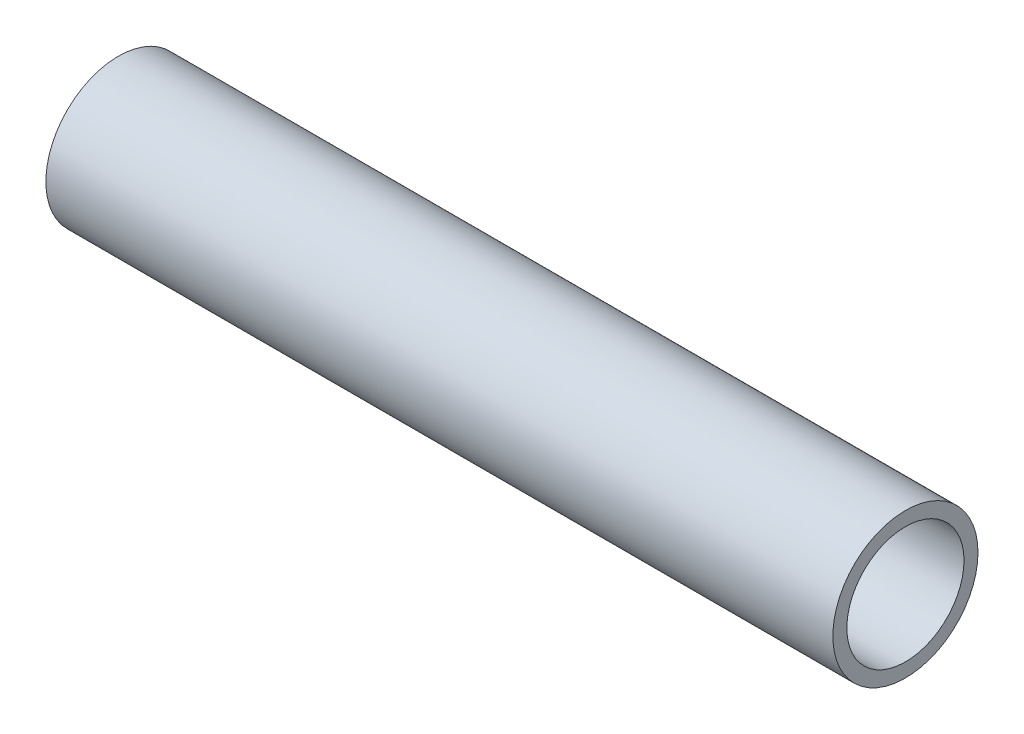
ISO-10303-21;
HEADER;
FILE_DESCRIPTION(('STEP AP214'),'2;1');
FILE_NAME('part.step','',(''),(''),'','','');
FILE_SCHEMA(('AUTOMOTIVE_DESIGN { 1 0 10303 214 1 1 1 1 }'));
ENDSEC;
DATA;
#1=APPLICATION_CONTEXT('core data for automotive mechanical design processes');
#2=APPLICATION_PROTOCOL_DEFINITION('international standard','automotive_design',2000,#1);
#3=PRODUCT_CONTEXT('',#1,'mechanical');
#4=PRODUCT('Part','Part','',(#3));
#5=PRODUCT_RELATED_PRODUCT_CATEGORY('part','',(#4));
#6=PRODUCT_DEFINITION_FORMATION('','',#4);
#7=PRODUCT_DEFINITION_CONTEXT('part definition',#1,'design');
#8=PRODUCT_DEFINITION('design','',#6,#7);
#9=PRODUCT_DEFINITION_SHAPE('','',#8);
#10=(LENGTH_UNIT() NAMED_UNIT(*) SI_UNIT(.MILLI.,.METRE.));
#11=(NAMED_UNIT(*) PLANE_ANGLE_UNIT() SI_UNIT($,.RADIAN.));
#12=(NAMED_UNIT(*) SI_UNIT($,.STERADIAN.) SOLID_ANGLE_UNIT());
#13=UNCERTAINTY_MEASURE_WITH_UNIT(LENGTH_MEASURE(1.E-05),#10,'distance_accuracy_value','');
#14=(GEOMETRIC_REPRESENTATION_CONTEXT(3) GLOBAL_UNCERTAINTY_ASSIGNED_CONTEXT((#13)) GLOBAL_UNIT_ASSIGNED_CONTEXT((#10,
#11,#12)) REPRESENTATION_CONTEXT('',''));
#15=CARTESIAN_POINT('',(0.,0.,0.));
#16=DIRECTION('',(0.,0.,1.));
#17=DIRECTION('',(1.,0.,0.));
#18=AXIS2_PLACEMENT_3D('',#15,#16,#17);
#19=CARTESIAN_POINT('',(228.6,0.,0.));
#20=DIRECTION('',(1.,0.,0.));
#21=DIRECTION('',(0.,0.,-1.));
#22=AXIS2_PLACEMENT_3D('',#19,#20,#21);
#23=PLANE('',#22);
#24=CARTESIAN_POINT('',(228.6,0.,0.));
#25=DIRECTION('',(1.,0.,0.));
#26=DIRECTION('',(0.,0.,-1.));
#27=AXIS2_PLACEMENT_3D('',#24,#25,#26);
#28=CIRCLE('',#27,21.082);
#29=CARTESIAN_POINT('',(228.6,0.,-21.082));
#30=VERTEX_POINT('',#29);
#31=EDGE_CURVE('E10',#30,#30,#28,.T.);
#32=ORIENTED_EDGE('',*,*,#31,.T.);
#33=EDGE_LOOP('',(#32));
#34=FACE_BOUND('',#33,.T.);
#35=CARTESIAN_POINT('',(228.6,0.,0.));
#36=DIRECTION('',(1.,0.,0.));
#37=DIRECTION('',(0.,0.,-1.));
#38=AXIS2_PLACEMENT_3D('',#35,#36,#37);
#39=CIRCLE('',#38,17.018);
#40=CARTESIAN_POINT('',(228.6,0.,-17.018));
#41=VERTEX_POINT('',#40);
#42=EDGE_CURVE('E45',#41,#41,#39,.T.);
#43=ORIENTED_EDGE('',*,*,#42,.F.);
#44=EDGE_LOOP('',(#43));
#45=FACE_BOUND('',#44,.T.);
#46=ADVANCED_FACE('F32',(#34,#45),#23,.T.);
#47=CARTESIAN_POINT('',(0.,0.,0.));
#48=DIRECTION('',(1.,0.,0.));
#49=DIRECTION('',(0.,0.,-1.));
#50=AXIS2_PLACEMENT_3D('',#47,#48,#49);
#51=PLANE('',#50);
#52=CARTESIAN_POINT('',(0.,0.,0.));
#53=DIRECTION('',(1.,0.,0.));
#54=DIRECTION('',(0.,0.,-1.));
#55=AXIS2_PLACEMENT_3D('',#52,#53,#54);
#56=CIRCLE('',#55,21.082);
#57=CARTESIAN_POINT('',(0.,0.,-21.082));
#58=VERTEX_POINT('',#57);
#59=EDGE_CURVE('E36',#58,#58,#56,.T.);
#60=ORIENTED_EDGE('',*,*,#59,.F.);
#61=EDGE_LOOP('',(#60));
#62=FACE_BOUND('',#61,.T.);
#63=CARTESIAN_POINT('',(0.,0.,0.));
#64=DIRECTION('',(1.,0.,0.));
#65=DIRECTION('',(0.,0.,-1.));
#66=AXIS2_PLACEMENT_3D('',#63,#64,#65);
#67=CIRCLE('',#66,17.018);
#68=CARTESIAN_POINT('',(0.,0.,-17.018));
#69=VERTEX_POINT('',#68);
#70=EDGE_CURVE('E47',#69,#69,#67,.T.);
#71=ORIENTED_EDGE('',*,*,#70,.T.);
#72=EDGE_LOOP('',(#71));
#73=FACE_BOUND('',#72,.T.);
#74=ADVANCED_FACE('F57',(#62,#73),#51,.F.);
#75=CARTESIAN_POINT('',(228.6,0.,0.));
#76=DIRECTION('',(-1.,0.,0.));
#77=DIRECTION('',(0.,0.,1.));
#78=AXIS2_PLACEMENT_3D('',#75,#76,#77);
#79=CYLINDRICAL_SURFACE('',#78,21.082);
#80=ORIENTED_EDGE('',*,*,#31,.F.);
#81=EDGE_LOOP('',(#80));
#82=FACE_BOUND('',#81,.T.);
#83=ORIENTED_EDGE('',*,*,#59,.T.);
#84=EDGE_LOOP('',(#83));
#85=FACE_BOUND('',#84,.T.);
#86=ADVANCED_FACE('F34',(#82,#85),#79,.T.);
#87=CARTESIAN_POINT('',(228.6,0.,0.));
#88=DIRECTION('',(-1.,0.,0.));
#89=DIRECTION('',(0.,0.,1.));
#90=AXIS2_PLACEMENT_3D('',#87,#88,#89);
#91=CYLINDRICAL_SURFACE('',#90,17.018);
#92=ORIENTED_EDGE('',*,*,#42,.T.);
#93=EDGE_LOOP('',(#92));
#94=FACE_BOUND('',#93,.T.);
#95=ORIENTED_EDGE('',*,*,#70,.F.);
#96=EDGE_LOOP('',(#95));
#97=FACE_BOUND('',#96,.T.);
#98=ADVANCED_FACE('F53',(#94,#97),#91,.F.);
#99=CLOSED_SHELL('',(#46,#74,#86,#98));
#100=MANIFOLD_SOLID_BREP('B2',#99);
#101=ADVANCED_BREP_SHAPE_REPRESENTATION('',(#18,#100),#14);
#102=SHAPE_DEFINITION_REPRESENTATION(#9,#101);
ENDSEC;
END-ISO-10303-21;
